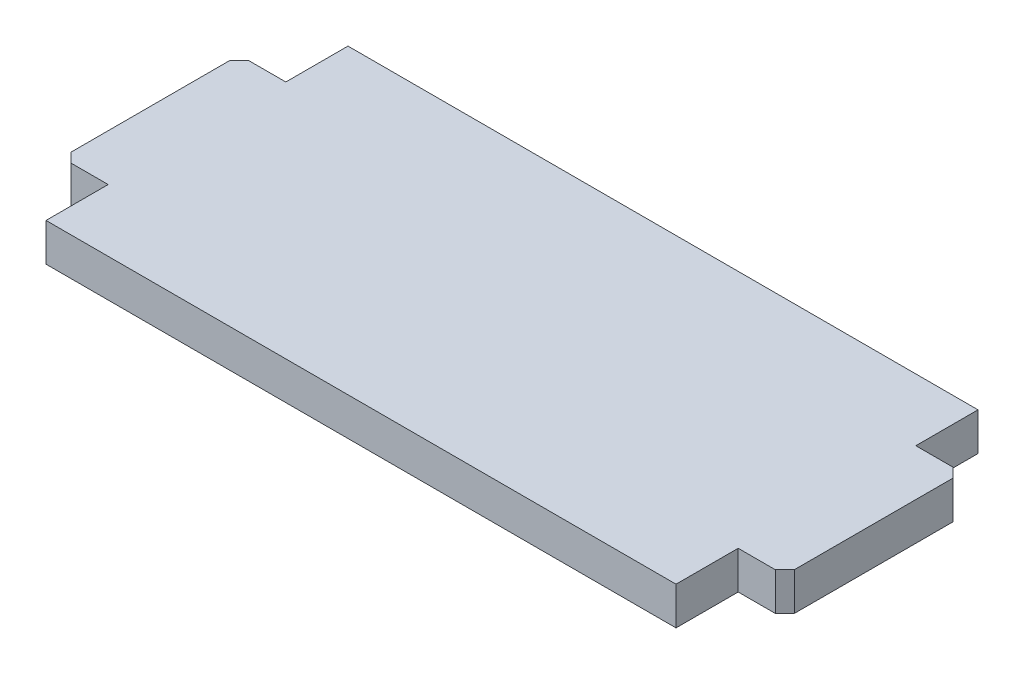
ISO-10303-21;
HEADER;
FILE_DESCRIPTION(('STEP AP214'),'2;1');
FILE_NAME('part.step','',(''),(''),'','','');
FILE_SCHEMA(('AUTOMOTIVE_DESIGN { 1 0 10303 214 1 1 1 1 }'));
ENDSEC;
DATA;
#1=APPLICATION_CONTEXT('core data for automotive mechanical design processes');
#2=APPLICATION_PROTOCOL_DEFINITION('international standard','automotive_design',2000,#1);
#3=PRODUCT_CONTEXT('',#1,'mechanical');
#4=PRODUCT('Part','Part','',(#3));
#5=PRODUCT_RELATED_PRODUCT_CATEGORY('part','',(#4));
#6=PRODUCT_DEFINITION_FORMATION('','',#4);
#7=PRODUCT_DEFINITION_CONTEXT('part definition',#1,'design');
#8=PRODUCT_DEFINITION('design','',#6,#7);
#9=PRODUCT_DEFINITION_SHAPE('','',#8);
#10=(LENGTH_UNIT() NAMED_UNIT(*) SI_UNIT(.MILLI.,.METRE.));
#11=(NAMED_UNIT(*) PLANE_ANGLE_UNIT() SI_UNIT($,.RADIAN.));
#12=(NAMED_UNIT(*) SI_UNIT($,.STERADIAN.) SOLID_ANGLE_UNIT());
#13=UNCERTAINTY_MEASURE_WITH_UNIT(LENGTH_MEASURE(1.E-05),#10,'distance_accuracy_value','');
#14=(GEOMETRIC_REPRESENTATION_CONTEXT(3) GLOBAL_UNCERTAINTY_ASSIGNED_CONTEXT((#13)) GLOBAL_UNIT_ASSIGNED_CONTEXT((#10,
#11,#12)) REPRESENTATION_CONTEXT('',''));
#15=CARTESIAN_POINT('',(0.,0.,0.));
#16=DIRECTION('',(0.,0.,1.));
#17=DIRECTION('',(1.,0.,0.));
#18=AXIS2_PLACEMENT_3D('',#15,#16,#17);
#19=CARTESIAN_POINT('',(-186.516,4.064,82.8675));
#20=DIRECTION('',(-1.,0.,0.));
#21=DIRECTION('',(0.,0.,1.));
#22=AXIS2_PLACEMENT_3D('',#19,#20,#21);
#23=PLANE('',#22);
#24=DIRECTION('',(0.,0.,-1.));
#25=VECTOR('',#24,1.);
#26=CARTESIAN_POINT('',(-186.516,0.,82.8675));
#27=LINE('',#26,#25);
#28=CARTESIAN_POINT('',(-186.516,0.,89.535));
#29=VERTEX_POINT('',#28);
#30=CARTESIAN_POINT('',(-186.516,0.,82.8675));
#31=VERTEX_POINT('',#30);
#32=EDGE_CURVE('E171',#29,#31,#27,.T.);
#33=ORIENTED_EDGE('',*,*,#32,.T.);
#34=DIRECTION('',(0.,-1.,0.));
#35=VECTOR('',#34,1.);
#36=CARTESIAN_POINT('',(-186.516,4.064,82.8675));
#37=LINE('',#36,#35);
#38=CARTESIAN_POINT('',(-186.516,4.064,82.8675));
#39=VERTEX_POINT('',#38);
#40=EDGE_CURVE('E153',#39,#31,#37,.T.);
#41=ORIENTED_EDGE('',*,*,#40,.F.);
#42=DIRECTION('',(0.,0.,-1.));
#43=VECTOR('',#42,1.);
#44=CARTESIAN_POINT('',(-186.516,4.064,82.8675));
#45=LINE('',#44,#43);
#46=CARTESIAN_POINT('',(-186.516,4.064,89.535));
#47=VERTEX_POINT('',#46);
#48=EDGE_CURVE('E159',#47,#39,#45,.T.);
#49=ORIENTED_EDGE('',*,*,#48,.F.);
#50=DIRECTION('',(0.,-1.,0.));
#51=VECTOR('',#50,1.);
#52=CARTESIAN_POINT('',(-186.516,4.064,89.535));
#53=LINE('',#52,#51);
#54=EDGE_CURVE('E232',#47,#29,#53,.T.);
#55=ORIENTED_EDGE('',*,*,#54,.T.);
#56=EDGE_LOOP('',(#33,#41,#49,#55));
#57=FACE_BOUND('',#56,.T.);
#58=ADVANCED_FACE('F35',(#57),#23,.F.);
#59=CARTESIAN_POINT('',(-181.516,4.064,82.8675));
#60=DIRECTION('',(0.,0.,-1.));
#61=DIRECTION('',(-1.,0.,0.));
#62=AXIS2_PLACEMENT_3D('',#59,#60,#61);
#63=PLANE('',#62);
#64=DIRECTION('',(1.,0.,0.));
#65=VECTOR('',#64,1.);
#66=CARTESIAN_POINT('',(-181.516,0.,82.8675));
#67=LINE('',#66,#65);
#68=CARTESIAN_POINT('',(-182.532,0.,82.8675));
#69=VERTEX_POINT('',#68);
#70=EDGE_CURVE('E268',#31,#69,#67,.T.);
#71=ORIENTED_EDGE('',*,*,#70,.T.);
#72=DIRECTION('',(0.,1.,0.));
#73=VECTOR('',#72,1.);
#74=CARTESIAN_POINT('',(-182.532,4.064,82.8675));
#75=LINE('',#74,#73);
#76=CARTESIAN_POINT('',(-182.532,4.064,82.8675));
#77=VERTEX_POINT('',#76);
#78=EDGE_CURVE('E156',#69,#77,#75,.T.);
#79=ORIENTED_EDGE('',*,*,#78,.T.);
#80=DIRECTION('',(1.,0.,0.));
#81=VECTOR('',#80,1.);
#82=CARTESIAN_POINT('',(-181.516,4.064,82.8675));
#83=LINE('',#82,#81);
#84=EDGE_CURVE('E148',#39,#77,#83,.T.);
#85=ORIENTED_EDGE('',*,*,#84,.F.);
#86=ORIENTED_EDGE('',*,*,#40,.T.);
#87=EDGE_LOOP('',(#71,#79,#85,#86));
#88=FACE_BOUND('',#87,.T.);
#89=ADVANCED_FACE('F151',(#88),#63,.F.);
#90=CARTESIAN_POINT('',(-181.516,4.064,63.8175));
#91=DIRECTION('',(-1.,0.,0.));
#92=DIRECTION('',(0.,0.,1.));
#93=AXIS2_PLACEMENT_3D('',#90,#91,#92);
#94=PLANE('',#93);
#95=DIRECTION('',(0.,0.,-1.));
#96=VECTOR('',#95,1.);
#97=CARTESIAN_POINT('',(-181.516,4.064,63.8175));
#98=LINE('',#97,#96);
#99=CARTESIAN_POINT('',(-181.516,4.064,81.8515));
#100=VERTEX_POINT('',#99);
#101=CARTESIAN_POINT('',(-181.516,4.064,64.8335));
#102=VERTEX_POINT('',#101);
#103=EDGE_CURVE('E158',#100,#102,#98,.T.);
#104=ORIENTED_EDGE('',*,*,#103,.F.);
#105=DIRECTION('',(0.,-1.,0.));
#106=VECTOR('',#105,1.);
#107=CARTESIAN_POINT('',(-181.516,4.064,81.8515));
#108=LINE('',#107,#106);
#109=CARTESIAN_POINT('',(-181.516,0.,81.8515));
#110=VERTEX_POINT('',#109);
#111=EDGE_CURVE('E175',#100,#110,#108,.T.);
#112=ORIENTED_EDGE('',*,*,#111,.T.);
#113=DIRECTION('',(0.,0.,-1.));
#114=VECTOR('',#113,1.);
#115=CARTESIAN_POINT('',(-181.516,0.,63.8175));
#116=LINE('',#115,#114);
#117=CARTESIAN_POINT('',(-181.516,0.,64.8335));
#118=VERTEX_POINT('',#117);
#119=EDGE_CURVE('E265',#110,#118,#116,.T.);
#120=ORIENTED_EDGE('',*,*,#119,.T.);
#121=DIRECTION('',(0.,1.,0.));
#122=VECTOR('',#121,1.);
#123=CARTESIAN_POINT('',(-181.516,4.064,64.8335));
#124=LINE('',#123,#122);
#125=EDGE_CURVE('E172',#118,#102,#124,.T.);
#126=ORIENTED_EDGE('',*,*,#125,.T.);
#127=EDGE_LOOP('',(#104,#112,#120,#126));
#128=FACE_BOUND('',#127,.T.);
#129=ADVANCED_FACE('F300',(#128),#94,.F.);
#130=CARTESIAN_POINT('',(-186.516,4.064,63.8175));
#131=DIRECTION('',(0.,0.,1.));
#132=DIRECTION('',(1.,0.,0.));
#133=AXIS2_PLACEMENT_3D('',#130,#131,#132);
#134=PLANE('',#133);
#135=DIRECTION('',(-1.,0.,0.));
#136=VECTOR('',#135,1.);
#137=CARTESIAN_POINT('',(-186.516,4.064,63.8175));
#138=LINE('',#137,#136);
#139=CARTESIAN_POINT('',(-182.532,4.064,63.8175));
#140=VERTEX_POINT('',#139);
#141=CARTESIAN_POINT('',(-186.516,4.064,63.8175));
#142=VERTEX_POINT('',#141);
#143=EDGE_CURVE('E285',#140,#142,#138,.T.);
#144=ORIENTED_EDGE('',*,*,#143,.F.);
#145=DIRECTION('',(0.,-1.,0.));
#146=VECTOR('',#145,1.);
#147=CARTESIAN_POINT('',(-182.532,4.064,63.8175));
#148=LINE('',#147,#146);
#149=CARTESIAN_POINT('',(-182.532,0.,63.8175));
#150=VERTEX_POINT('',#149);
#151=EDGE_CURVE('E200',#140,#150,#148,.T.);
#152=ORIENTED_EDGE('',*,*,#151,.T.);
#153=DIRECTION('',(-1.,0.,0.));
#154=VECTOR('',#153,1.);
#155=CARTESIAN_POINT('',(-186.516,0.,63.8175));
#156=LINE('',#155,#154);
#157=CARTESIAN_POINT('',(-186.516,0.,63.8175));
#158=VERTEX_POINT('',#157);
#159=EDGE_CURVE('E261',#150,#158,#156,.T.);
#160=ORIENTED_EDGE('',*,*,#159,.T.);
#161=DIRECTION('',(0.,-1.,0.));
#162=VECTOR('',#161,1.);
#163=CARTESIAN_POINT('',(-186.516,4.064,63.8175));
#164=LINE('',#163,#162);
#165=EDGE_CURVE('E173',#142,#158,#164,.T.);
#166=ORIENTED_EDGE('',*,*,#165,.F.);
#167=EDGE_LOOP('',(#144,#152,#160,#166));
#168=FACE_BOUND('',#167,.T.);
#169=ADVANCED_FACE('F298',(#168),#134,.F.);
#170=CARTESIAN_POINT('',(-186.516,4.064,57.15));
#171=DIRECTION('',(-1.,0.,0.));
#172=DIRECTION('',(0.,0.,1.));
#173=AXIS2_PLACEMENT_3D('',#170,#171,#172);
#174=PLANE('',#173);
#175=DIRECTION('',(0.,0.,-1.));
#176=VECTOR('',#175,1.);
#177=CARTESIAN_POINT('',(-186.516,0.,57.15));
#178=LINE('',#177,#176);
#179=CARTESIAN_POINT('',(-186.516,0.,57.15));
#180=VERTEX_POINT('',#179);
#181=EDGE_CURVE('E259',#158,#180,#178,.T.);
#182=ORIENTED_EDGE('',*,*,#181,.T.);
#183=DIRECTION('',(0.,-1.,0.));
#184=VECTOR('',#183,1.);
#185=CARTESIAN_POINT('',(-186.516,4.064,57.15));
#186=LINE('',#185,#184);
#187=CARTESIAN_POINT('',(-186.516,4.064,57.15));
#188=VERTEX_POINT('',#187);
#189=EDGE_CURVE('E178',#188,#180,#186,.T.);
#190=ORIENTED_EDGE('',*,*,#189,.F.);
#191=DIRECTION('',(0.,0.,-1.));
#192=VECTOR('',#191,1.);
#193=CARTESIAN_POINT('',(-186.516,4.064,57.15));
#194=LINE('',#193,#192);
#195=EDGE_CURVE('E283',#142,#188,#194,.T.);
#196=ORIENTED_EDGE('',*,*,#195,.F.);
#197=ORIENTED_EDGE('',*,*,#165,.T.);
#198=EDGE_LOOP('',(#182,#190,#196,#197));
#199=FACE_BOUND('',#198,.T.);
#200=ADVANCED_FACE('F359',(#199),#174,.F.);
#201=CARTESIAN_POINT('',(-254.08,4.064,57.15));
#202=DIRECTION('',(0.,0.,1.));
#203=DIRECTION('',(1.,0.,0.));
#204=AXIS2_PLACEMENT_3D('',#201,#202,#203);
#205=PLANE('',#204);
#206=DIRECTION('',(-1.,0.,0.));
#207=VECTOR('',#206,1.);
#208=CARTESIAN_POINT('',(-254.08,0.,57.15));
#209=LINE('',#208,#207);
#210=CARTESIAN_POINT('',(-254.08,0.,57.15));
#211=VERTEX_POINT('',#210);
#212=EDGE_CURVE('E252',#180,#211,#209,.T.);
#213=ORIENTED_EDGE('',*,*,#212,.T.);
#214=DIRECTION('',(0.,-1.,0.));
#215=VECTOR('',#214,1.);
#216=CARTESIAN_POINT('',(-254.08,4.064,57.15));
#217=LINE('',#216,#215);
#218=CARTESIAN_POINT('',(-254.08,4.064,57.15));
#219=VERTEX_POINT('',#218);
#220=EDGE_CURVE('E243',#219,#211,#217,.T.);
#221=ORIENTED_EDGE('',*,*,#220,.F.);
#222=DIRECTION('',(-1.,0.,0.));
#223=VECTOR('',#222,1.);
#224=CARTESIAN_POINT('',(-254.08,4.064,57.15));
#225=LINE('',#224,#223);
#226=EDGE_CURVE('E253',#188,#219,#225,.T.);
#227=ORIENTED_EDGE('',*,*,#226,.F.);
#228=ORIENTED_EDGE('',*,*,#189,.T.);
#229=EDGE_LOOP('',(#213,#221,#227,#228));
#230=FACE_BOUND('',#229,.T.);
#231=ADVANCED_FACE('F250',(#230),#205,.F.);
#232=CARTESIAN_POINT('',(-254.08,4.064,57.15));
#233=DIRECTION('',(1.,0.,0.));
#234=DIRECTION('',(0.,0.,-1.));
#235=AXIS2_PLACEMENT_3D('',#232,#233,#234);
#236=PLANE('',#235);
#237=DIRECTION('',(0.,0.,1.));
#238=VECTOR('',#237,1.);
#239=CARTESIAN_POINT('',(-254.08,0.,57.15));
#240=LINE('',#239,#238);
#241=CARTESIAN_POINT('',(-254.08,0.,63.8175));
#242=VERTEX_POINT('',#241);
#243=EDGE_CURVE('E226',#211,#242,#240,.T.);
#244=ORIENTED_EDGE('',*,*,#243,.T.);
#245=DIRECTION('',(0.,-1.,0.));
#246=VECTOR('',#245,1.);
#247=CARTESIAN_POINT('',(-254.08,4.064,63.8175));
#248=LINE('',#247,#246);
#249=CARTESIAN_POINT('',(-254.08,4.064,63.8175));
#250=VERTEX_POINT('',#249);
#251=EDGE_CURVE('E240',#250,#242,#248,.T.);
#252=ORIENTED_EDGE('',*,*,#251,.F.);
#253=DIRECTION('',(0.,0.,1.));
#254=VECTOR('',#253,1.);
#255=CARTESIAN_POINT('',(-254.08,4.064,57.15));
#256=LINE('',#255,#254);
#257=EDGE_CURVE('E280',#219,#250,#256,.T.);
#258=ORIENTED_EDGE('',*,*,#257,.F.);
#259=ORIENTED_EDGE('',*,*,#220,.T.);
#260=EDGE_LOOP('',(#244,#252,#258,#259));
#261=FACE_BOUND('',#260,.T.);
#262=ADVANCED_FACE('F352',(#261),#236,.F.);
#263=CARTESIAN_POINT('',(-254.08,4.064,63.8175));
#264=DIRECTION('',(0.,0.,1.));
#265=DIRECTION('',(1.,0.,0.));
#266=AXIS2_PLACEMENT_3D('',#263,#264,#265);
#267=PLANE('',#266);
#268=DIRECTION('',(-1.,0.,0.));
#269=VECTOR('',#268,1.);
#270=CARTESIAN_POINT('',(-254.08,0.,63.8175));
#271=LINE('',#270,#269);
#272=CARTESIAN_POINT('',(-258.064,0.,63.8175));
#273=VERTEX_POINT('',#272);
#274=EDGE_CURVE('E222',#242,#273,#271,.T.);
#275=ORIENTED_EDGE('',*,*,#274,.T.);
#276=DIRECTION('',(0.,1.,0.));
#277=VECTOR('',#276,1.);
#278=CARTESIAN_POINT('',(-258.064,4.064,63.8175));
#279=LINE('',#278,#277);
#280=CARTESIAN_POINT('',(-258.064,4.064,63.8175));
#281=VERTEX_POINT('',#280);
#282=EDGE_CURVE('E11',#273,#281,#279,.T.);
#283=ORIENTED_EDGE('',*,*,#282,.T.);
#284=DIRECTION('',(-1.,0.,0.));
#285=VECTOR('',#284,1.);
#286=CARTESIAN_POINT('',(-254.08,4.064,63.8175));
#287=LINE('',#286,#285);
#288=EDGE_CURVE('E277',#250,#281,#287,.T.);
#289=ORIENTED_EDGE('',*,*,#288,.F.);
#290=ORIENTED_EDGE('',*,*,#251,.T.);
#291=EDGE_LOOP('',(#275,#283,#289,#290));
#292=FACE_BOUND('',#291,.T.);
#293=ADVANCED_FACE('F349',(#292),#267,.F.);
#294=CARTESIAN_POINT('',(-259.08,4.064,63.8175));
#295=DIRECTION('',(1.,0.,0.));
#296=DIRECTION('',(0.,0.,-1.));
#297=AXIS2_PLACEMENT_3D('',#294,#295,#296);
#298=PLANE('',#297);
#299=DIRECTION('',(0.,0.,1.));
#300=VECTOR('',#299,1.);
#301=CARTESIAN_POINT('',(-259.08,0.,63.8175));
#302=LINE('',#301,#300);
#303=CARTESIAN_POINT('',(-259.08,0.,64.8335));
#304=VERTEX_POINT('',#303);
#305=CARTESIAN_POINT('',(-259.08,0.,81.8514999999999));
#306=VERTEX_POINT('',#305);
#307=EDGE_CURVE('E211',#304,#306,#302,.T.);
#308=ORIENTED_EDGE('',*,*,#307,.T.);
#309=DIRECTION('',(0.,1.,0.));
#310=VECTOR('',#309,1.);
#311=CARTESIAN_POINT('',(-259.08,4.064,81.8514999999999));
#312=LINE('',#311,#310);
#313=CARTESIAN_POINT('',(-259.08,4.064,81.8514999999999));
#314=VERTEX_POINT('',#313);
#315=EDGE_CURVE('E43',#306,#314,#312,.T.);
#316=ORIENTED_EDGE('',*,*,#315,.T.);
#317=DIRECTION('',(0.,0.,1.));
#318=VECTOR('',#317,1.);
#319=CARTESIAN_POINT('',(-259.08,4.064,63.8175));
#320=LINE('',#319,#318);
#321=CARTESIAN_POINT('',(-259.08,4.064,64.8335));
#322=VERTEX_POINT('',#321);
#323=EDGE_CURVE('E212',#322,#314,#320,.T.);
#324=ORIENTED_EDGE('',*,*,#323,.F.);
#325=DIRECTION('',(0.,-1.,0.));
#326=VECTOR('',#325,1.);
#327=CARTESIAN_POINT('',(-259.08,4.064,64.8335));
#328=LINE('',#327,#326);
#329=EDGE_CURVE('E206',#322,#304,#328,.T.);
#330=ORIENTED_EDGE('',*,*,#329,.T.);
#331=EDGE_LOOP('',(#308,#316,#324,#330));
#332=FACE_BOUND('',#331,.T.);
#333=ADVANCED_FACE('F210',(#332),#298,.F.);
#334=CARTESIAN_POINT('',(-259.08,4.064,82.8675));
#335=DIRECTION('',(0.,0.,-1.));
#336=DIRECTION('',(-1.,0.,0.));
#337=AXIS2_PLACEMENT_3D('',#334,#335,#336);
#338=PLANE('',#337);
#339=DIRECTION('',(1.,0.,0.));
#340=VECTOR('',#339,1.);
#341=CARTESIAN_POINT('',(-259.08,4.064,82.8675));
#342=LINE('',#341,#340);
#343=CARTESIAN_POINT('',(-258.064,4.064,82.8675));
#344=VERTEX_POINT('',#343);
#345=CARTESIAN_POINT('',(-254.08,4.064,82.8675));
#346=VERTEX_POINT('',#345);
#347=EDGE_CURVE('E274',#344,#346,#342,.T.);
#348=ORIENTED_EDGE('',*,*,#347,.F.);
#349=DIRECTION('',(0.,-1.,0.));
#350=VECTOR('',#349,1.);
#351=CARTESIAN_POINT('',(-258.064,4.064,82.8675));
#352=LINE('',#351,#350);
#353=CARTESIAN_POINT('',(-258.064,0.,82.8675));
#354=VERTEX_POINT('',#353);
#355=EDGE_CURVE('E203',#344,#354,#352,.T.);
#356=ORIENTED_EDGE('',*,*,#355,.T.);
#357=DIRECTION('',(1.,0.,0.));
#358=VECTOR('',#357,1.);
#359=CARTESIAN_POINT('',(-259.08,0.,82.8675));
#360=LINE('',#359,#358);
#361=CARTESIAN_POINT('',(-254.08,0.,82.8675));
#362=VERTEX_POINT('',#361);
#363=EDGE_CURVE('E221',#354,#362,#360,.T.);
#364=ORIENTED_EDGE('',*,*,#363,.T.);
#365=DIRECTION('',(0.,-1.,0.));
#366=VECTOR('',#365,1.);
#367=CARTESIAN_POINT('',(-254.08,4.064,82.8675));
#368=LINE('',#367,#366);
#369=EDGE_CURVE('E237',#346,#362,#368,.T.);
#370=ORIENTED_EDGE('',*,*,#369,.F.);
#371=EDGE_LOOP('',(#348,#356,#364,#370));
#372=FACE_BOUND('',#371,.T.);
#373=ADVANCED_FACE('F313',(#372),#338,.F.);
#374=CARTESIAN_POINT('',(-254.08,4.064,82.8675));
#375=DIRECTION('',(1.,0.,0.));
#376=DIRECTION('',(0.,0.,-1.));
#377=AXIS2_PLACEMENT_3D('',#374,#375,#376);
#378=PLANE('',#377);
#379=DIRECTION('',(0.,0.,1.));
#380=VECTOR('',#379,1.);
#381=CARTESIAN_POINT('',(-254.08,0.,82.8675));
#382=LINE('',#381,#380);
#383=CARTESIAN_POINT('',(-254.08,0.,89.535));
#384=VERTEX_POINT('',#383);
#385=EDGE_CURVE('E224',#362,#384,#382,.T.);
#386=ORIENTED_EDGE('',*,*,#385,.T.);
#387=DIRECTION('',(0.,-1.,0.));
#388=VECTOR('',#387,1.);
#389=CARTESIAN_POINT('',(-254.08,4.064,89.535));
#390=LINE('',#389,#388);
#391=CARTESIAN_POINT('',(-254.08,4.064,89.535));
#392=VERTEX_POINT('',#391);
#393=EDGE_CURVE('E234',#392,#384,#390,.T.);
#394=ORIENTED_EDGE('',*,*,#393,.F.);
#395=DIRECTION('',(0.,0.,1.));
#396=VECTOR('',#395,1.);
#397=CARTESIAN_POINT('',(-254.08,4.064,82.8675));
#398=LINE('',#397,#396);
#399=EDGE_CURVE('E272',#346,#392,#398,.T.);
#400=ORIENTED_EDGE('',*,*,#399,.F.);
#401=ORIENTED_EDGE('',*,*,#369,.T.);
#402=EDGE_LOOP('',(#386,#394,#400,#401));
#403=FACE_BOUND('',#402,.T.);
#404=ADVANCED_FACE('F310',(#403),#378,.F.);
#405=CARTESIAN_POINT('',(-254.08,4.064,89.535));
#406=DIRECTION('',(0.,0.,-1.));
#407=DIRECTION('',(-1.,0.,0.));
#408=AXIS2_PLACEMENT_3D('',#405,#406,#407);
#409=PLANE('',#408);
#410=DIRECTION('',(1.,0.,0.));
#411=VECTOR('',#410,1.);
#412=CARTESIAN_POINT('',(-254.08,0.,89.535));
#413=LINE('',#412,#411);
#414=EDGE_CURVE('E168',#384,#29,#413,.T.);
#415=ORIENTED_EDGE('',*,*,#414,.T.);
#416=ORIENTED_EDGE('',*,*,#54,.F.);
#417=DIRECTION('',(1.,0.,0.));
#418=VECTOR('',#417,1.);
#419=CARTESIAN_POINT('',(-254.08,4.064,89.535));
#420=LINE('',#419,#418);
#421=EDGE_CURVE('E164',#392,#47,#420,.T.);
#422=ORIENTED_EDGE('',*,*,#421,.F.);
#423=ORIENTED_EDGE('',*,*,#393,.T.);
#424=EDGE_LOOP('',(#415,#416,#422,#423));
#425=FACE_BOUND('',#424,.T.);
#426=ADVANCED_FACE('F306',(#425),#409,.F.);
#427=CARTESIAN_POINT('',(0.,4.064,0.));
#428=DIRECTION('',(0.,1.,0.));
#429=DIRECTION('',(0.,0.,1.));
#430=AXIS2_PLACEMENT_3D('',#427,#428,#429);
#431=PLANE('',#430);
#432=ORIENTED_EDGE('',*,*,#84,.T.);
#433=DIRECTION('',(-0.707106781186552,0.,0.707106781186543));
#434=VECTOR('',#433,1.);
#435=CARTESIAN_POINT('',(-49.8322499999987,4.064,-49.8322499999994));
#436=LINE('',#435,#434);
#437=EDGE_CURVE('E198',#77,#100,#436,.F.);
#438=ORIENTED_EDGE('',*,*,#437,.T.);
#439=ORIENTED_EDGE('',*,*,#103,.T.);
#440=DIRECTION('',(0.707106781186548,0.,0.707106781186548));
#441=VECTOR('',#440,1.);
#442=CARTESIAN_POINT('',(-123.17475,4.064,123.17475));
#443=LINE('',#442,#441);
#444=EDGE_CURVE('E196',#102,#140,#443,.F.);
#445=ORIENTED_EDGE('',*,*,#444,.T.);
#446=ORIENTED_EDGE('',*,*,#143,.T.);
#447=ORIENTED_EDGE('',*,*,#195,.T.);
#448=ORIENTED_EDGE('',*,*,#226,.T.);
#449=ORIENTED_EDGE('',*,*,#257,.T.);
#450=ORIENTED_EDGE('',*,*,#288,.T.);
#451=DIRECTION('',(0.707106781186543,0.,-0.707106781186552));
#452=VECTOR('',#451,1.);
#453=CARTESIAN_POINT('',(-97.1232500000018,4.064,-97.1232500000004));
#454=LINE('',#453,#452);
#455=EDGE_CURVE('E193',#281,#322,#454,.F.);
#456=ORIENTED_EDGE('',*,*,#455,.T.);
#457=ORIENTED_EDGE('',*,*,#323,.T.);
#458=DIRECTION('',(-0.707106781186538,0.,-0.707106781186557));
#459=VECTOR('',#458,1.);
#460=CARTESIAN_POINT('',(-170.465750000003,4.064,170.465749999999));
#461=LINE('',#460,#459);
#462=EDGE_CURVE('E50',#314,#344,#461,.F.);
#463=ORIENTED_EDGE('',*,*,#462,.T.);
#464=ORIENTED_EDGE('',*,*,#347,.T.);
#465=ORIENTED_EDGE('',*,*,#399,.T.);
#466=ORIENTED_EDGE('',*,*,#421,.T.);
#467=ORIENTED_EDGE('',*,*,#48,.T.);
#468=EDGE_LOOP('',(#432,#438,#439,#445,#446,#447,#448,#449,#450,#456,#457,#463,#464,#465,#466,#467));
#469=FACE_BOUND('',#468,.T.);
#470=ADVANCED_FACE('F162',(#469),#431,.T.);
#471=CARTESIAN_POINT('',(0.,0.,0.));
#472=DIRECTION('',(0.,1.,0.));
#473=DIRECTION('',(0.,0.,1.));
#474=AXIS2_PLACEMENT_3D('',#471,#472,#473);
#475=PLANE('',#474);
#476=ORIENTED_EDGE('',*,*,#119,.F.);
#477=DIRECTION('',(0.707106781186552,0.,-0.707106781186543));
#478=VECTOR('',#477,1.);
#479=CARTESIAN_POINT('',(-181.516,0.,81.8515));
#480=LINE('',#479,#478);
#481=EDGE_CURVE('E190',#110,#69,#480,.F.);
#482=ORIENTED_EDGE('',*,*,#481,.T.);
#483=ORIENTED_EDGE('',*,*,#70,.F.);
#484=ORIENTED_EDGE('',*,*,#32,.F.);
#485=ORIENTED_EDGE('',*,*,#414,.F.);
#486=ORIENTED_EDGE('',*,*,#385,.F.);
#487=ORIENTED_EDGE('',*,*,#363,.F.);
#488=DIRECTION('',(0.707106781186538,0.,0.707106781186557));
#489=VECTOR('',#488,1.);
#490=CARTESIAN_POINT('',(-258.064,0.,82.8675));
#491=LINE('',#490,#489);
#492=EDGE_CURVE('E186',#354,#306,#491,.F.);
#493=ORIENTED_EDGE('',*,*,#492,.T.);
#494=ORIENTED_EDGE('',*,*,#307,.F.);
#495=DIRECTION('',(-0.707106781186543,0.,0.707106781186552));
#496=VECTOR('',#495,1.);
#497=CARTESIAN_POINT('',(-259.08,0.,64.8335));
#498=LINE('',#497,#496);
#499=EDGE_CURVE('E184',#304,#273,#498,.F.);
#500=ORIENTED_EDGE('',*,*,#499,.T.);
#501=ORIENTED_EDGE('',*,*,#274,.F.);
#502=ORIENTED_EDGE('',*,*,#243,.F.);
#503=ORIENTED_EDGE('',*,*,#212,.F.);
#504=ORIENTED_EDGE('',*,*,#181,.F.);
#505=ORIENTED_EDGE('',*,*,#159,.F.);
#506=DIRECTION('',(-0.707106781186548,0.,-0.707106781186548));
#507=VECTOR('',#506,1.);
#508=CARTESIAN_POINT('',(-182.532,0.,63.8175));
#509=LINE('',#508,#507);
#510=EDGE_CURVE('E188',#150,#118,#509,.F.);
#511=ORIENTED_EDGE('',*,*,#510,.T.);
#512=EDGE_LOOP('',(#476,#482,#483,#484,#485,#486,#487,#493,#494,#500,#501,#502,#503,#504,#505,#511));
#513=FACE_BOUND('',#512,.T.);
#514=ADVANCED_FACE('F217',(#513),#475,.F.);
#515=CARTESIAN_POINT('',(-181.516,4.064,81.8515));
#516=DIRECTION('',(-0.707106781186543,0.,-0.707106781186552));
#517=DIRECTION('',(0.,-1.,0.));
#518=AXIS2_PLACEMENT_3D('',#515,#516,#517);
#519=PLANE('',#518);
#520=ORIENTED_EDGE('',*,*,#437,.F.);
#521=ORIENTED_EDGE('',*,*,#78,.F.);
#522=ORIENTED_EDGE('',*,*,#481,.F.);
#523=ORIENTED_EDGE('',*,*,#111,.F.);
#524=EDGE_LOOP('',(#520,#521,#522,#523));
#525=FACE_BOUND('',#524,.T.);
#526=ADVANCED_FACE('F302',(#525),#519,.F.);
#527=CARTESIAN_POINT('',(-182.532,4.064,63.8175));
#528=DIRECTION('',(-0.707106781186548,0.,0.707106781186548));
#529=DIRECTION('',(0.,-1.,0.));
#530=AXIS2_PLACEMENT_3D('',#527,#528,#529);
#531=PLANE('',#530);
#532=ORIENTED_EDGE('',*,*,#444,.F.);
#533=ORIENTED_EDGE('',*,*,#125,.F.);
#534=ORIENTED_EDGE('',*,*,#510,.F.);
#535=ORIENTED_EDGE('',*,*,#151,.F.);
#536=EDGE_LOOP('',(#532,#533,#534,#535));
#537=FACE_BOUND('',#536,.T.);
#538=ADVANCED_FACE('F296',(#537),#531,.F.);
#539=CARTESIAN_POINT('',(-258.064,4.064,82.8675));
#540=DIRECTION('',(0.707106781186557,0.,-0.707106781186538));
#541=DIRECTION('',(0.,-1.,0.));
#542=AXIS2_PLACEMENT_3D('',#539,#540,#541);
#543=PLANE('',#542);
#544=ORIENTED_EDGE('',*,*,#462,.F.);
#545=ORIENTED_EDGE('',*,*,#315,.F.);
#546=ORIENTED_EDGE('',*,*,#492,.F.);
#547=ORIENTED_EDGE('',*,*,#355,.F.);
#548=EDGE_LOOP('',(#544,#545,#546,#547));
#549=FACE_BOUND('',#548,.T.);
#550=ADVANCED_FACE('F316',(#549),#543,.F.);
#551=CARTESIAN_POINT('',(-259.08,4.064,64.8335));
#552=DIRECTION('',(0.707106781186552,0.,0.707106781186543));
#553=DIRECTION('',(0.,-1.,0.));
#554=AXIS2_PLACEMENT_3D('',#551,#552,#553);
#555=PLANE('',#554);
#556=ORIENTED_EDGE('',*,*,#455,.F.);
#557=ORIENTED_EDGE('',*,*,#282,.F.);
#558=ORIENTED_EDGE('',*,*,#499,.F.);
#559=ORIENTED_EDGE('',*,*,#329,.F.);
#560=EDGE_LOOP('',(#556,#557,#558,#559));
#561=FACE_BOUND('',#560,.T.);
#562=ADVANCED_FACE('F37',(#561),#555,.F.);
#563=CLOSED_SHELL('',(#58,#89,#129,#169,#200,#231,#262,#293,#333,#373,#404,#426,#470,#514,#526,
#538,#550,#562));
#564=MANIFOLD_SOLID_BREP('B2',#563);
#565=ADVANCED_BREP_SHAPE_REPRESENTATION('',(#18,#564),#14);
#566=SHAPE_DEFINITION_REPRESENTATION(#9,#565);
ENDSEC;
END-ISO-10303-21;
